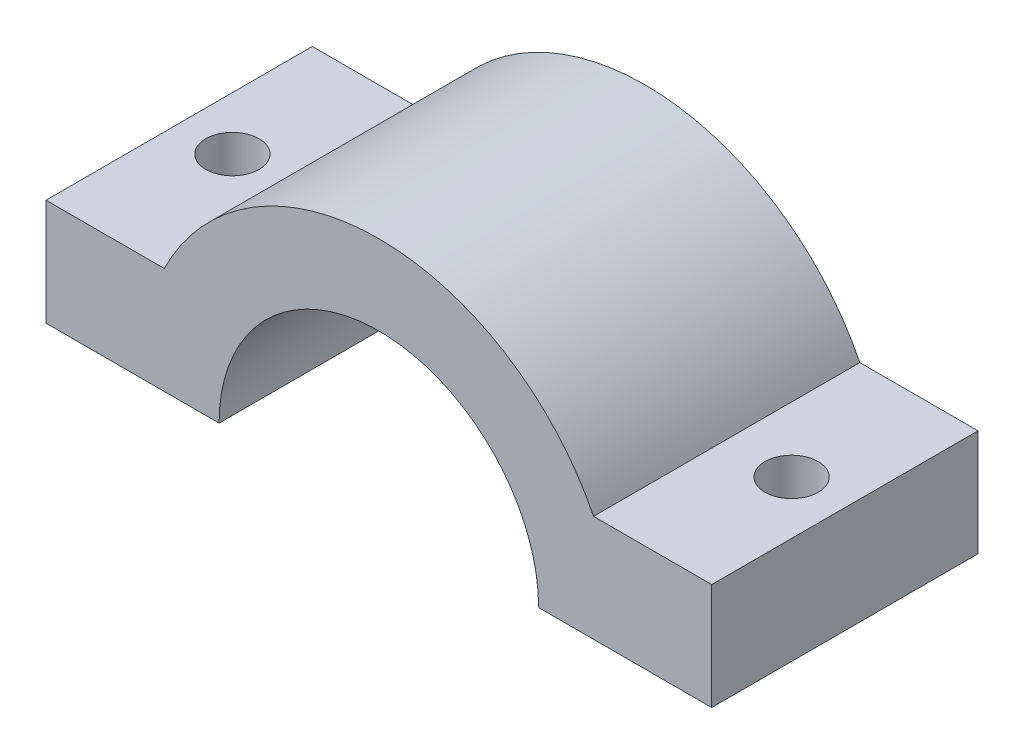
ISO-10303-21;
HEADER;
FILE_DESCRIPTION(('STEP AP214'),'2;1');
FILE_NAME('part.step','',(''),(''),'','','');
FILE_SCHEMA(('AUTOMOTIVE_DESIGN { 1 0 10303 214 1 1 1 1 }'));
ENDSEC;
DATA;
#1=APPLICATION_CONTEXT('core data for automotive mechanical design processes');
#2=APPLICATION_PROTOCOL_DEFINITION('international standard','automotive_design',2000,#1);
#3=PRODUCT_CONTEXT('',#1,'mechanical');
#4=PRODUCT('Part','Part','',(#3));
#5=PRODUCT_RELATED_PRODUCT_CATEGORY('part','',(#4));
#6=PRODUCT_DEFINITION_FORMATION('','',#4);
#7=PRODUCT_DEFINITION_CONTEXT('part definition',#1,'design');
#8=PRODUCT_DEFINITION('design','',#6,#7);
#9=PRODUCT_DEFINITION_SHAPE('','',#8);
#10=(LENGTH_UNIT() NAMED_UNIT(*) SI_UNIT(.MILLI.,.METRE.));
#11=(NAMED_UNIT(*) PLANE_ANGLE_UNIT() SI_UNIT($,.RADIAN.));
#12=(NAMED_UNIT(*) SI_UNIT($,.STERADIAN.) SOLID_ANGLE_UNIT());
#13=UNCERTAINTY_MEASURE_WITH_UNIT(LENGTH_MEASURE(1.E-05),#10,'distance_accuracy_value','');
#14=(GEOMETRIC_REPRESENTATION_CONTEXT(3) GLOBAL_UNCERTAINTY_ASSIGNED_CONTEXT((#13)) GLOBAL_UNIT_ASSIGNED_CONTEXT((#10,
#11,#12)) REPRESENTATION_CONTEXT('',''));
#15=CARTESIAN_POINT('',(0.,0.,0.));
#16=DIRECTION('',(0.,0.,1.));
#17=DIRECTION('',(1.,0.,0.));
#18=AXIS2_PLACEMENT_3D('',#15,#16,#17);
#19=CARTESIAN_POINT('',(-8.06225774829854,2.,10.));
#20=DIRECTION('',(0.,-1.,0.));
#21=DIRECTION('',(1.,0.,0.));
#22=AXIS2_PLACEMENT_3D('',#19,#20,#21);
#23=PLANE('',#22);
#24=CARTESIAN_POINT('',(-10.5,2.,5.));
#25=DIRECTION('',(0.,-1.,0.));
#26=DIRECTION('',(1.,0.,0.));
#27=AXIS2_PLACEMENT_3D('',#24,#25,#26);
#28=CIRCLE('',#27,1.);
#29=CARTESIAN_POINT('',(-9.50000000000001,2.,5.));
#30=VERTEX_POINT('',#29);
#31=EDGE_CURVE('E187',#30,#30,#28,.T.);
#32=ORIENTED_EDGE('',*,*,#31,.T.);
#33=EDGE_LOOP('',(#32));
#34=FACE_BOUND('',#33,.T.);
#35=DIRECTION('',(-1.,0.,0.));
#36=VECTOR('',#35,1.);
#37=CARTESIAN_POINT('',(-8.06225774829854,2.,0.));
#38=LINE('',#37,#36);
#39=CARTESIAN_POINT('',(-8.06225774829854,2.,0.));
#40=VERTEX_POINT('',#39);
#41=CARTESIAN_POINT('',(-12.5,2.,0.));
#42=VERTEX_POINT('',#41);
#43=EDGE_CURVE('E133',#40,#42,#38,.T.);
#44=ORIENTED_EDGE('',*,*,#43,.T.);
#45=DIRECTION('',(0.,0.,-1.));
#46=VECTOR('',#45,1.);
#47=CARTESIAN_POINT('',(-12.5,2.,10.));
#48=LINE('',#47,#46);
#49=CARTESIAN_POINT('',(-12.5,2.,10.));
#50=VERTEX_POINT('',#49);
#51=EDGE_CURVE('E11',#50,#42,#48,.T.);
#52=ORIENTED_EDGE('',*,*,#51,.F.);
#53=DIRECTION('',(-1.,0.,0.));
#54=VECTOR('',#53,1.);
#55=CARTESIAN_POINT('',(-8.06225774829854,2.,10.));
#56=LINE('',#55,#54);
#57=CARTESIAN_POINT('',(-8.06225774829854,2.,10.));
#58=VERTEX_POINT('',#57);
#59=EDGE_CURVE('E148',#58,#50,#56,.T.);
#60=ORIENTED_EDGE('',*,*,#59,.F.);
#61=DIRECTION('',(0.,0.,-1.));
#62=VECTOR('',#61,1.);
#63=CARTESIAN_POINT('',(-8.06225774829854,2.,10.));
#64=LINE('',#63,#62);
#65=EDGE_CURVE('E129',#58,#40,#64,.T.);
#66=ORIENTED_EDGE('',*,*,#65,.T.);
#67=EDGE_LOOP('',(#44,#52,#60,#66));
#68=FACE_BOUND('',#67,.T.);
#69=ADVANCED_FACE('F36',(#34,#68),#23,.F.);
#70=CARTESIAN_POINT('',(-12.5,-2.,10.));
#71=DIRECTION('',(1.,0.,0.));
#72=DIRECTION('',(0.,0.,-1.));
#73=AXIS2_PLACEMENT_3D('',#70,#71,#72);
#74=PLANE('',#73);
#75=DIRECTION('',(0.,-1.,0.));
#76=VECTOR('',#75,1.);
#77=CARTESIAN_POINT('',(-12.5,-2.,0.));
#78=LINE('',#77,#76);
#79=CARTESIAN_POINT('',(-12.5,-2.,0.));
#80=VERTEX_POINT('',#79);
#81=EDGE_CURVE('E136',#42,#80,#78,.T.);
#82=ORIENTED_EDGE('',*,*,#81,.T.);
#83=DIRECTION('',(0.,0.,-1.));
#84=VECTOR('',#83,1.);
#85=CARTESIAN_POINT('',(-12.5,-2.,10.));
#86=LINE('',#85,#84);
#87=CARTESIAN_POINT('',(-12.5,-2.,10.));
#88=VERTEX_POINT('',#87);
#89=EDGE_CURVE('E45',#88,#80,#86,.T.);
#90=ORIENTED_EDGE('',*,*,#89,.F.);
#91=DIRECTION('',(0.,-1.,0.));
#92=VECTOR('',#91,1.);
#93=CARTESIAN_POINT('',(-12.5,-2.,10.));
#94=LINE('',#93,#92);
#95=EDGE_CURVE('E96',#50,#88,#94,.T.);
#96=ORIENTED_EDGE('',*,*,#95,.F.);
#97=ORIENTED_EDGE('',*,*,#51,.T.);
#98=EDGE_LOOP('',(#82,#90,#96,#97));
#99=FACE_BOUND('',#98,.T.);
#100=ADVANCED_FACE('F197',(#99),#74,.F.);
#101=CARTESIAN_POINT('',(-6.,-2.,10.));
#102=DIRECTION('',(0.,1.,0.));
#103=DIRECTION('',(-1.,0.,0.));
#104=AXIS2_PLACEMENT_3D('',#101,#102,#103);
#105=PLANE('',#104);
#106=CARTESIAN_POINT('',(-10.5,-2.,5.));
#107=DIRECTION('',(0.,1.,0.));
#108=DIRECTION('',(-1.,0.,0.));
#109=AXIS2_PLACEMENT_3D('',#106,#107,#108);
#110=CIRCLE('',#109,1.);
#111=CARTESIAN_POINT('',(-11.5,-2.,5.));
#112=VERTEX_POINT('',#111);
#113=EDGE_CURVE('E39',#112,#112,#110,.F.);
#114=ORIENTED_EDGE('',*,*,#113,.F.);
#115=EDGE_LOOP('',(#114));
#116=FACE_BOUND('',#115,.T.);
#117=DIRECTION('',(1.,0.,0.));
#118=VECTOR('',#117,1.);
#119=CARTESIAN_POINT('',(-6.,-2.,0.));
#120=LINE('',#119,#118);
#121=CARTESIAN_POINT('',(-6.,-2.,0.));
#122=VERTEX_POINT('',#121);
#123=EDGE_CURVE('E139',#80,#122,#120,.T.);
#124=ORIENTED_EDGE('',*,*,#123,.T.);
#125=DIRECTION('',(0.,0.,-1.));
#126=VECTOR('',#125,1.);
#127=CARTESIAN_POINT('',(-6.,-2.,10.));
#128=LINE('',#127,#126);
#129=CARTESIAN_POINT('',(-6.,-2.,10.));
#130=VERTEX_POINT('',#129);
#131=EDGE_CURVE('E155',#130,#122,#128,.T.);
#132=ORIENTED_EDGE('',*,*,#131,.F.);
#133=DIRECTION('',(1.,0.,0.));
#134=VECTOR('',#133,1.);
#135=CARTESIAN_POINT('',(-6.,-2.,10.));
#136=LINE('',#135,#134);
#137=EDGE_CURVE('E164',#88,#130,#136,.T.);
#138=ORIENTED_EDGE('',*,*,#137,.F.);
#139=ORIENTED_EDGE('',*,*,#89,.T.);
#140=EDGE_LOOP('',(#124,#132,#138,#139));
#141=FACE_BOUND('',#140,.T.);
#142=ADVANCED_FACE('F162',(#116,#141),#105,.F.);
#143=CARTESIAN_POINT('',(0.,-2.,10.));
#144=DIRECTION('',(0.,0.,-1.));
#145=DIRECTION('',(-1.,0.,0.));
#146=AXIS2_PLACEMENT_3D('',#143,#144,#145);
#147=CYLINDRICAL_SURFACE('',#146,6.);
#148=CARTESIAN_POINT('',(0.,-2.,0.));
#149=DIRECTION('',(0.,0.,-1.));
#150=DIRECTION('',(1.,0.,0.));
#151=AXIS2_PLACEMENT_3D('',#148,#149,#150);
#152=CIRCLE('',#151,6.);
#153=CARTESIAN_POINT('',(6.00000000000001,-2.,0.));
#154=VERTEX_POINT('',#153);
#155=EDGE_CURVE('E141',#122,#154,#152,.T.);
#156=ORIENTED_EDGE('',*,*,#155,.T.);
#157=DIRECTION('',(0.,0.,-1.));
#158=VECTOR('',#157,1.);
#159=CARTESIAN_POINT('',(6.00000000000001,-2.,10.));
#160=LINE('',#159,#158);
#161=CARTESIAN_POINT('',(6.00000000000001,-2.,10.));
#162=VERTEX_POINT('',#161);
#163=EDGE_CURVE('E152',#162,#154,#160,.T.);
#164=ORIENTED_EDGE('',*,*,#163,.F.);
#165=CARTESIAN_POINT('',(0.,-2.,10.));
#166=DIRECTION('',(0.,0.,-1.));
#167=DIRECTION('',(1.,0.,0.));
#168=AXIS2_PLACEMENT_3D('',#165,#166,#167);
#169=CIRCLE('',#168,6.);
#170=EDGE_CURVE('E176',#130,#162,#169,.T.);
#171=ORIENTED_EDGE('',*,*,#170,.F.);
#172=ORIENTED_EDGE('',*,*,#131,.T.);
#173=EDGE_LOOP('',(#156,#164,#171,#172));
#174=FACE_BOUND('',#173,.T.);
#175=ADVANCED_FACE('F172',(#174),#147,.F.);
#176=CARTESIAN_POINT('',(12.5,-2.,10.));
#177=DIRECTION('',(0.,1.,0.));
#178=DIRECTION('',(-1.,0.,0.));
#179=AXIS2_PLACEMENT_3D('',#176,#177,#178);
#180=PLANE('',#179);
#181=CARTESIAN_POINT('',(10.5,-2.,5.));
#182=DIRECTION('',(0.,1.,0.));
#183=DIRECTION('',(-1.,0.,0.));
#184=AXIS2_PLACEMENT_3D('',#181,#182,#183);
#185=CIRCLE('',#184,1.);
#186=CARTESIAN_POINT('',(9.50000000000001,-2.,5.));
#187=VERTEX_POINT('',#186);
#188=EDGE_CURVE('E137',#187,#187,#185,.T.);
#189=ORIENTED_EDGE('',*,*,#188,.T.);
#190=EDGE_LOOP('',(#189));
#191=FACE_BOUND('',#190,.T.);
#192=DIRECTION('',(1.,0.,0.));
#193=VECTOR('',#192,1.);
#194=CARTESIAN_POINT('',(12.5,-2.,0.));
#195=LINE('',#194,#193);
#196=CARTESIAN_POINT('',(12.5,-2.,0.));
#197=VERTEX_POINT('',#196);
#198=EDGE_CURVE('E143',#154,#197,#195,.T.);
#199=ORIENTED_EDGE('',*,*,#198,.T.);
#200=DIRECTION('',(0.,0.,-1.));
#201=VECTOR('',#200,1.);
#202=CARTESIAN_POINT('',(12.5,-2.,10.));
#203=LINE('',#202,#201);
#204=CARTESIAN_POINT('',(12.5,-2.,10.));
#205=VERTEX_POINT('',#204);
#206=EDGE_CURVE('E124',#205,#197,#203,.T.);
#207=ORIENTED_EDGE('',*,*,#206,.F.);
#208=DIRECTION('',(1.,0.,0.));
#209=VECTOR('',#208,1.);
#210=CARTESIAN_POINT('',(12.5,-2.,10.));
#211=LINE('',#210,#209);
#212=EDGE_CURVE('E115',#162,#205,#211,.T.);
#213=ORIENTED_EDGE('',*,*,#212,.F.);
#214=ORIENTED_EDGE('',*,*,#163,.T.);
#215=EDGE_LOOP('',(#199,#207,#213,#214));
#216=FACE_BOUND('',#215,.T.);
#217=ADVANCED_FACE('F175',(#191,#216),#180,.F.);
#218=CARTESIAN_POINT('',(12.5,-2.,10.));
#219=DIRECTION('',(-1.,0.,0.));
#220=DIRECTION('',(0.,0.,1.));
#221=AXIS2_PLACEMENT_3D('',#218,#219,#220);
#222=PLANE('',#221);
#223=DIRECTION('',(0.,1.,0.));
#224=VECTOR('',#223,1.);
#225=CARTESIAN_POINT('',(12.5,-2.,0.));
#226=LINE('',#225,#224);
#227=CARTESIAN_POINT('',(12.5,2.,0.));
#228=VERTEX_POINT('',#227);
#229=EDGE_CURVE('E123',#197,#228,#226,.T.);
#230=ORIENTED_EDGE('',*,*,#229,.T.);
#231=DIRECTION('',(0.,0.,-1.));
#232=VECTOR('',#231,1.);
#233=CARTESIAN_POINT('',(12.5,2.,10.));
#234=LINE('',#233,#232);
#235=CARTESIAN_POINT('',(12.5,2.,10.));
#236=VERTEX_POINT('',#235);
#237=EDGE_CURVE('E120',#236,#228,#234,.T.);
#238=ORIENTED_EDGE('',*,*,#237,.F.);
#239=DIRECTION('',(0.,1.,0.));
#240=VECTOR('',#239,1.);
#241=CARTESIAN_POINT('',(12.5,-2.,10.));
#242=LINE('',#241,#240);
#243=EDGE_CURVE('E109',#205,#236,#242,.T.);
#244=ORIENTED_EDGE('',*,*,#243,.F.);
#245=ORIENTED_EDGE('',*,*,#206,.T.);
#246=EDGE_LOOP('',(#230,#238,#244,#245));
#247=FACE_BOUND('',#246,.T.);
#248=ADVANCED_FACE('F121',(#247),#222,.F.);
#249=CARTESIAN_POINT('',(12.5,2.,10.));
#250=DIRECTION('',(0.,-1.,0.));
#251=DIRECTION('',(1.,0.,0.));
#252=AXIS2_PLACEMENT_3D('',#249,#250,#251);
#253=PLANE('',#252);
#254=CARTESIAN_POINT('',(10.5,2.,5.));
#255=DIRECTION('',(0.,1.,0.));
#256=DIRECTION('',(-1.,0.,0.));
#257=AXIS2_PLACEMENT_3D('',#254,#255,#256);
#258=CIRCLE('',#257,1.);
#259=CARTESIAN_POINT('',(9.50000000000001,2.,5.));
#260=VERTEX_POINT('',#259);
#261=EDGE_CURVE('E184',#260,#260,#258,.T.);
#262=ORIENTED_EDGE('',*,*,#261,.F.);
#263=EDGE_LOOP('',(#262));
#264=FACE_BOUND('',#263,.T.);
#265=DIRECTION('',(-1.,0.,0.));
#266=VECTOR('',#265,1.);
#267=CARTESIAN_POINT('',(12.5,2.,0.));
#268=LINE('',#267,#266);
#269=CARTESIAN_POINT('',(8.06225774829855,2.,0.));
#270=VERTEX_POINT('',#269);
#271=EDGE_CURVE('E82',#228,#270,#268,.T.);
#272=ORIENTED_EDGE('',*,*,#271,.T.);
#273=DIRECTION('',(0.,0.,-1.));
#274=VECTOR('',#273,1.);
#275=CARTESIAN_POINT('',(8.06225774829855,2.,10.));
#276=LINE('',#275,#274);
#277=CARTESIAN_POINT('',(8.06225774829855,2.,10.));
#278=VERTEX_POINT('',#277);
#279=EDGE_CURVE('E125',#278,#270,#276,.T.);
#280=ORIENTED_EDGE('',*,*,#279,.F.);
#281=DIRECTION('',(-1.,0.,0.));
#282=VECTOR('',#281,1.);
#283=CARTESIAN_POINT('',(12.5,2.,10.));
#284=LINE('',#283,#282);
#285=EDGE_CURVE('E113',#236,#278,#284,.T.);
#286=ORIENTED_EDGE('',*,*,#285,.F.);
#287=ORIENTED_EDGE('',*,*,#237,.T.);
#288=EDGE_LOOP('',(#272,#280,#286,#287));
#289=FACE_BOUND('',#288,.T.);
#290=ADVANCED_FACE('F127',(#264,#289),#253,.F.);
#291=CARTESIAN_POINT('',(0.,-2.,10.));
#292=DIRECTION('',(0.,0.,-1.));
#293=DIRECTION('',(-1.,0.,0.));
#294=AXIS2_PLACEMENT_3D('',#291,#292,#293);
#295=CYLINDRICAL_SURFACE('',#294,9.);
#296=CARTESIAN_POINT('',(0.,-2.,0.));
#297=DIRECTION('',(0.,0.,1.));
#298=DIRECTION('',(1.,0.,0.));
#299=AXIS2_PLACEMENT_3D('',#296,#297,#298);
#300=CIRCLE('',#299,9.);
#301=EDGE_CURVE('E88',#270,#40,#300,.T.);
#302=ORIENTED_EDGE('',*,*,#301,.T.);
#303=ORIENTED_EDGE('',*,*,#65,.F.);
#304=CARTESIAN_POINT('',(0.,-2.,10.));
#305=DIRECTION('',(0.,0.,1.));
#306=DIRECTION('',(1.,0.,0.));
#307=AXIS2_PLACEMENT_3D('',#304,#305,#306);
#308=CIRCLE('',#307,9.);
#309=EDGE_CURVE('E53',#278,#58,#308,.T.);
#310=ORIENTED_EDGE('',*,*,#309,.F.);
#311=ORIENTED_EDGE('',*,*,#279,.T.);
#312=EDGE_LOOP('',(#302,#303,#310,#311));
#313=FACE_BOUND('',#312,.T.);
#314=ADVANCED_FACE('F210',(#313),#295,.T.);
#315=CARTESIAN_POINT('',(0.,-2.,10.));
#316=DIRECTION('',(0.,0.,1.));
#317=DIRECTION('',(1.,0.,0.));
#318=AXIS2_PLACEMENT_3D('',#315,#316,#317);
#319=PLANE('',#318);
#320=ORIENTED_EDGE('',*,*,#59,.T.);
#321=ORIENTED_EDGE('',*,*,#95,.T.);
#322=ORIENTED_EDGE('',*,*,#137,.T.);
#323=ORIENTED_EDGE('',*,*,#170,.T.);
#324=ORIENTED_EDGE('',*,*,#212,.T.);
#325=ORIENTED_EDGE('',*,*,#243,.T.);
#326=ORIENTED_EDGE('',*,*,#285,.T.);
#327=ORIENTED_EDGE('',*,*,#309,.T.);
#328=EDGE_LOOP('',(#320,#321,#322,#323,#324,#325,#326,#327));
#329=FACE_BOUND('',#328,.T.);
#330=ADVANCED_FACE('F111',(#329),#319,.T.);
#331=CARTESIAN_POINT('',(0.,-2.,0.));
#332=DIRECTION('',(0.,0.,1.));
#333=DIRECTION('',(1.,0.,0.));
#334=AXIS2_PLACEMENT_3D('',#331,#332,#333);
#335=PLANE('',#334);
#336=ORIENTED_EDGE('',*,*,#43,.F.);
#337=ORIENTED_EDGE('',*,*,#301,.F.);
#338=ORIENTED_EDGE('',*,*,#271,.F.);
#339=ORIENTED_EDGE('',*,*,#229,.F.);
#340=ORIENTED_EDGE('',*,*,#198,.F.);
#341=ORIENTED_EDGE('',*,*,#155,.F.);
#342=ORIENTED_EDGE('',*,*,#123,.F.);
#343=ORIENTED_EDGE('',*,*,#81,.F.);
#344=EDGE_LOOP('',(#336,#337,#338,#339,#340,#341,#342,#343));
#345=FACE_BOUND('',#344,.T.);
#346=ADVANCED_FACE('F168',(#345),#335,.F.);
#347=CARTESIAN_POINT('',(10.5,-8.,5.));
#348=DIRECTION('',(0.,1.,0.));
#349=DIRECTION('',(-1.,0.,0.));
#350=AXIS2_PLACEMENT_3D('',#347,#348,#349);
#351=CYLINDRICAL_SURFACE('',#350,1.);
#352=ORIENTED_EDGE('',*,*,#261,.T.);
#353=EDGE_LOOP('',(#352));
#354=FACE_BOUND('',#353,.T.);
#355=ORIENTED_EDGE('',*,*,#188,.F.);
#356=EDGE_LOOP('',(#355));
#357=FACE_BOUND('',#356,.T.);
#358=ADVANCED_FACE('F230',(#354,#357),#351,.F.);
#359=CARTESIAN_POINT('',(-10.5,-8.,5.));
#360=DIRECTION('',(0.,1.,0.));
#361=DIRECTION('',(-1.,0.,0.));
#362=AXIS2_PLACEMENT_3D('',#359,#360,#361);
#363=CYLINDRICAL_SURFACE('',#362,1.);
#364=ORIENTED_EDGE('',*,*,#31,.F.);
#365=EDGE_LOOP('',(#364));
#366=FACE_BOUND('',#365,.T.);
#367=ORIENTED_EDGE('',*,*,#113,.T.);
#368=EDGE_LOOP('',(#367));
#369=FACE_BOUND('',#368,.T.);
#370=ADVANCED_FACE('F194',(#366,#369),#363,.F.);
#371=CLOSED_SHELL('',(#69,#100,#142,#175,#217,#248,#290,#314,#330,#346,#358,#370));
#372=MANIFOLD_SOLID_BREP('B2',#371);
#373=ADVANCED_BREP_SHAPE_REPRESENTATION('',(#18,#372),#14);
#374=SHAPE_DEFINITION_REPRESENTATION(#9,#373);
ENDSEC;
END-ISO-10303-21;
